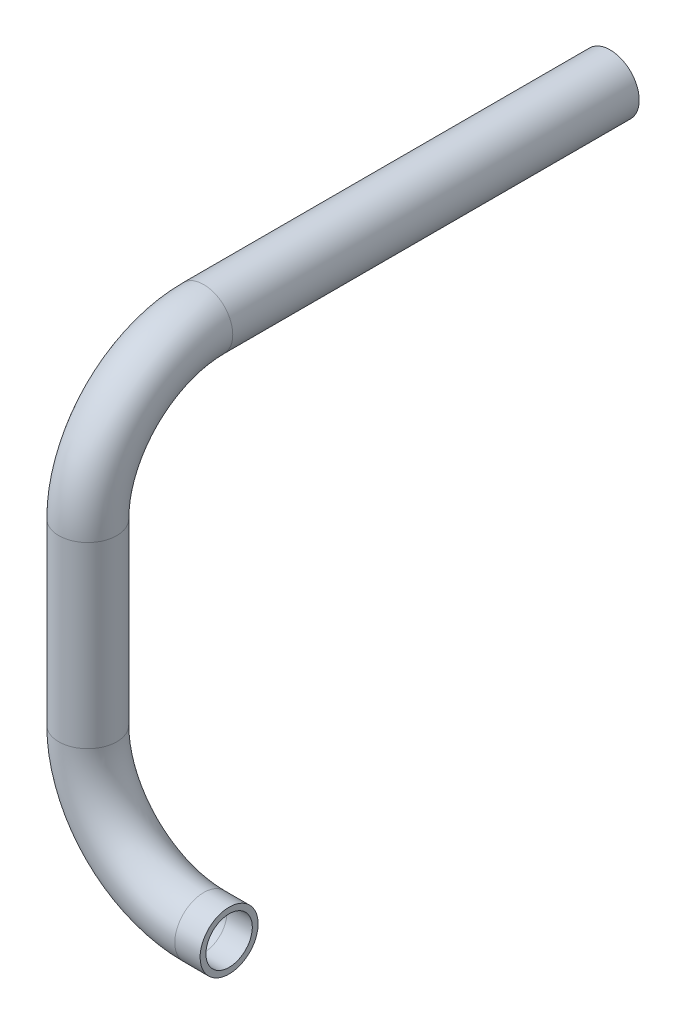
ISO-10303-21;
HEADER;
FILE_DESCRIPTION(('STEP AP214'),'2;1');
FILE_NAME('part.step','',(''),(''),'','','');
FILE_SCHEMA(('AUTOMOTIVE_DESIGN { 1 0 10303 214 1 1 1 1 }'));
ENDSEC;
DATA;
#1=APPLICATION_CONTEXT('core data for automotive mechanical design processes');
#2=APPLICATION_PROTOCOL_DEFINITION('international standard','automotive_design',2000,#1);
#3=PRODUCT_CONTEXT('',#1,'mechanical');
#4=PRODUCT('Part','Part','',(#3));
#5=PRODUCT_RELATED_PRODUCT_CATEGORY('part','',(#4));
#6=PRODUCT_DEFINITION_FORMATION('','',#4);
#7=PRODUCT_DEFINITION_CONTEXT('part definition',#1,'design');
#8=PRODUCT_DEFINITION('design','',#6,#7);
#9=PRODUCT_DEFINITION_SHAPE('','',#8);
#10=(LENGTH_UNIT() NAMED_UNIT(*) SI_UNIT(.MILLI.,.METRE.));
#11=(NAMED_UNIT(*) PLANE_ANGLE_UNIT() SI_UNIT($,.RADIAN.));
#12=(NAMED_UNIT(*) SI_UNIT($,.STERADIAN.) SOLID_ANGLE_UNIT());
#13=UNCERTAINTY_MEASURE_WITH_UNIT(LENGTH_MEASURE(1.E-05),#10,'distance_accuracy_value','');
#14=(GEOMETRIC_REPRESENTATION_CONTEXT(3) GLOBAL_UNCERTAINTY_ASSIGNED_CONTEXT((#13)) GLOBAL_UNIT_ASSIGNED_CONTEXT((#10,
#11,#12)) REPRESENTATION_CONTEXT('',''));
#15=CARTESIAN_POINT('',(0.,0.,0.));
#16=DIRECTION('',(0.,0.,1.));
#17=DIRECTION('',(1.,0.,0.));
#18=AXIS2_PLACEMENT_3D('',#15,#16,#17);
#19=CARTESIAN_POINT('',(-267.546047560903,126.276355940926,20.559623431255));
#20=DIRECTION('',(0.,0.,1.));
#21=DIRECTION('',(1.,0.,0.));
#22=AXIS2_PLACEMENT_3D('',#19,#20,#21);
#23=CYLINDRICAL_SURFACE('',#22,6.34999999999999);
#24=CARTESIAN_POINT('',(-267.546047560903,126.276355940926,109.564142662024));
#25=DIRECTION('',(0.,0.,1.));
#26=DIRECTION('',(1.,0.,0.));
#27=AXIS2_PLACEMENT_3D('',#24,#25,#26);
#28=CIRCLE('',#27,6.34999999999999);
#29=CARTESIAN_POINT('',(-267.546047560903,132.626355940925,109.564142662024));
#30=VERTEX_POINT('',#29);
#31=EDGE_CURVE('E57',#30,#30,#28,.T.);
#32=ORIENTED_EDGE('',*,*,#31,.F.);
#33=EDGE_LOOP('',(#32));
#34=FACE_BOUND('',#33,.T.);
#35=CARTESIAN_POINT('',(-267.546047560903,126.276355940926,20.559623431255));
#36=DIRECTION('',(0.,0.,1.));
#37=DIRECTION('',(1.,0.,0.));
#38=AXIS2_PLACEMENT_3D('',#35,#36,#37);
#39=CIRCLE('',#38,6.34999999999999);
#40=CARTESIAN_POINT('',(-261.196047560903,126.276355940926,20.559623431255));
#41=VERTEX_POINT('',#40);
#42=EDGE_CURVE('E54',#41,#41,#39,.T.);
#43=ORIENTED_EDGE('',*,*,#42,.T.);
#44=EDGE_LOOP('',(#43));
#45=FACE_BOUND('',#44,.T.);
#46=ADVANCED_FACE('F33',(#34,#45),#23,.T.);
#47=CARTESIAN_POINT('',(-267.546047560903,100.876355940926,109.564142662024));
#48=DIRECTION('',(1.,0.,0.));
#49=DIRECTION('',(0.,0.,-1.));
#50=AXIS2_PLACEMENT_3D('',#47,#48,#49);
#51=TOROIDAL_SURFACE('',#50,25.4,6.34999999999999);
#52=CARTESIAN_POINT('',(-267.546047560903,100.876355940926,134.964142662024));
#53=DIRECTION('',(0.,-1.,0.));
#54=DIRECTION('',(1.,0.,0.));
#55=AXIS2_PLACEMENT_3D('',#52,#53,#54);
#56=CIRCLE('',#55,6.34999999999999);
#57=CARTESIAN_POINT('',(-267.546047560903,100.876355940926,141.314142662024));
#58=VERTEX_POINT('',#57);
#59=EDGE_CURVE('E60',#58,#58,#56,.T.);
#60=CARTESIAN_POINT('',(-267.546047560903,100.876355940926,109.564142662024));
#61=DIRECTION('',(1.,0.,0.));
#62=DIRECTION('',(0.,0.,-1.));
#63=AXIS2_PLACEMENT_3D('',#60,#61,#62);
#64=CIRCLE('',#63,31.75);
#65=EDGE_CURVE('',#30,#58,#64,.T.);
#66=ORIENTED_EDGE('',*,*,#31,.T.);
#67=ORIENTED_EDGE('',*,*,#59,.F.);
#68=ORIENTED_EDGE('',*,*,#65,.T.);
#69=ORIENTED_EDGE('',*,*,#65,.F.);
#70=EDGE_LOOP('',(#66,#68,#67,#69));
#71=FACE_BOUND('',#70,.T.);
#72=ADVANCED_FACE('F79',(#71),#51,.T.);
#73=CARTESIAN_POINT('',(-267.546047560903,100.876355940926,134.964142662024));
#74=DIRECTION('',(0.,-1.,0.));
#75=DIRECTION('',(0.,0.,-1.));
#76=AXIS2_PLACEMENT_3D('',#73,#74,#75);
#77=CYLINDRICAL_SURFACE('',#76,6.34999999999999);
#78=CARTESIAN_POINT('',(-267.546047560903,61.7763559409256,134.964142662024));
#79=DIRECTION('',(0.,-1.,0.));
#80=DIRECTION('',(1.,0.,0.));
#81=AXIS2_PLACEMENT_3D('',#78,#79,#80);
#82=CIRCLE('',#81,6.34999999999999);
#83=CARTESIAN_POINT('',(-273.896047560903,61.7763559409256,134.964142662024));
#84=VERTEX_POINT('',#83);
#85=EDGE_CURVE('E62',#84,#84,#82,.T.);
#86=ORIENTED_EDGE('',*,*,#85,.F.);
#87=EDGE_LOOP('',(#86));
#88=FACE_BOUND('',#87,.T.);
#89=ORIENTED_EDGE('',*,*,#59,.T.);
#90=EDGE_LOOP('',(#89));
#91=FACE_BOUND('',#90,.T.);
#92=ADVANCED_FACE('F72',(#88,#91),#77,.T.);
#93=CARTESIAN_POINT('',(-242.146047560903,61.7763559409256,134.964142662024));
#94=DIRECTION('',(0.,0.,1.));
#95=DIRECTION('',(1.,0.,0.));
#96=AXIS2_PLACEMENT_3D('',#93,#94,#95);
#97=TOROIDAL_SURFACE('',#96,25.4,6.34999999999999);
#98=CARTESIAN_POINT('',(-242.146047560903,36.3763559409256,134.964142662024));
#99=DIRECTION('',(1.,0.,0.));
#100=DIRECTION('',(0.,1.,0.));
#101=AXIS2_PLACEMENT_3D('',#98,#99,#100);
#102=CIRCLE('',#101,6.34999999999999);
#103=CARTESIAN_POINT('',(-242.146047560903,30.0263559409256,134.964142662024));
#104=VERTEX_POINT('',#103);
#105=EDGE_CURVE('E37',#104,#104,#102,.T.);
#106=CARTESIAN_POINT('',(-242.146047560903,61.7763559409256,134.964142662024));
#107=DIRECTION('',(0.,0.,1.));
#108=DIRECTION('',(1.,0.,0.));
#109=AXIS2_PLACEMENT_3D('',#106,#107,#108);
#110=CIRCLE('',#109,31.75);
#111=EDGE_CURVE('',#84,#104,#110,.T.);
#112=ORIENTED_EDGE('',*,*,#85,.T.);
#113=ORIENTED_EDGE('',*,*,#105,.F.);
#114=ORIENTED_EDGE('',*,*,#111,.T.);
#115=ORIENTED_EDGE('',*,*,#111,.F.);
#116=EDGE_LOOP('',(#112,#114,#113,#115));
#117=FACE_BOUND('',#116,.T.);
#118=ADVANCED_FACE('F70',(#117),#97,.T.);
#119=CARTESIAN_POINT('',(-242.146047560903,36.3763559409256,134.964142662024));
#120=DIRECTION('',(1.,0.,0.));
#121=DIRECTION('',(0.,0.,-1.));
#122=AXIS2_PLACEMENT_3D('',#119,#120,#121);
#123=CYLINDRICAL_SURFACE('',#122,6.34999999999999);
#124=CARTESIAN_POINT('',(-236.59359429767,36.3763559409256,134.964142662024));
#125=DIRECTION('',(1.,0.,0.));
#126=DIRECTION('',(0.,1.,0.));
#127=AXIS2_PLACEMENT_3D('',#124,#125,#126);
#128=CIRCLE('',#127,6.34999999999999);
#129=CARTESIAN_POINT('',(-236.59359429767,42.7263559409256,134.964142662024));
#130=VERTEX_POINT('',#129);
#131=EDGE_CURVE('E50',#130,#130,#128,.T.);
#132=ORIENTED_EDGE('',*,*,#131,.F.);
#133=EDGE_LOOP('',(#132));
#134=FACE_BOUND('',#133,.T.);
#135=ORIENTED_EDGE('',*,*,#105,.T.);
#136=EDGE_LOOP('',(#135));
#137=FACE_BOUND('',#136,.T.);
#138=ADVANCED_FACE('F35',(#134,#137),#123,.T.);
#139=CARTESIAN_POINT('',(-267.546047560903,126.276355940926,20.559623431255));
#140=DIRECTION('',(0.,0.,1.));
#141=DIRECTION('',(1.,0.,0.));
#142=AXIS2_PLACEMENT_3D('',#139,#140,#141);
#143=PLANE('',#142);
#144=CARTESIAN_POINT('',(-267.546047560903,126.276355940926,20.559623431255));
#145=DIRECTION('',(0.,0.,1.));
#146=DIRECTION('',(1.,0.,0.));
#147=AXIS2_PLACEMENT_3D('',#144,#145,#146);
#148=CIRCLE('',#147,5.08000000000002);
#149=CARTESIAN_POINT('',(-262.466047560903,126.276355940926,20.559623431255));
#150=VERTEX_POINT('',#149);
#151=EDGE_CURVE('E53',#150,#150,#148,.F.);
#152=ORIENTED_EDGE('',*,*,#151,.F.);
#153=EDGE_LOOP('',(#152));
#154=FACE_BOUND('',#153,.T.);
#155=ORIENTED_EDGE('',*,*,#42,.F.);
#156=EDGE_LOOP('',(#155));
#157=FACE_BOUND('',#156,.T.);
#158=ADVANCED_FACE('F77',(#154,#157),#143,.F.);
#159=CARTESIAN_POINT('',(-236.59359429767,36.3763559409256,134.964142662024));
#160=DIRECTION('',(1.,0.,0.));
#161=DIRECTION('',(0.,1.,0.));
#162=AXIS2_PLACEMENT_3D('',#159,#160,#161);
#163=PLANE('',#162);
#164=CARTESIAN_POINT('',(-236.59359429767,36.3763559409256,134.964142662024));
#165=DIRECTION('',(1.,0.,0.));
#166=DIRECTION('',(0.,1.,0.));
#167=AXIS2_PLACEMENT_3D('',#164,#165,#166);
#168=CIRCLE('',#167,5.08000000000002);
#169=CARTESIAN_POINT('',(-236.59359429767,41.4563559409256,134.964142662024));
#170=VERTEX_POINT('',#169);
#171=EDGE_CURVE('E10',#170,#170,#168,.F.);
#172=ORIENTED_EDGE('',*,*,#171,.T.);
#173=EDGE_LOOP('',(#172));
#174=FACE_BOUND('',#173,.T.);
#175=ORIENTED_EDGE('',*,*,#131,.T.);
#176=EDGE_LOOP('',(#175));
#177=FACE_BOUND('',#176,.T.);
#178=ADVANCED_FACE('F96',(#174,#177),#163,.T.);
#179=CARTESIAN_POINT('',(-267.546047560903,126.276355940926,20.559623431255));
#180=DIRECTION('',(0.,0.,1.));
#181=DIRECTION('',(1.,0.,0.));
#182=AXIS2_PLACEMENT_3D('',#179,#180,#181);
#183=CYLINDRICAL_SURFACE('',#182,5.08000000000002);
#184=CARTESIAN_POINT('',(-267.546047560903,126.276355940926,109.564142662024));
#185=DIRECTION('',(0.,0.,1.));
#186=DIRECTION('',(1.,0.,0.));
#187=AXIS2_PLACEMENT_3D('',#184,#185,#186);
#188=CIRCLE('',#187,5.08000000000002);
#189=CARTESIAN_POINT('',(-267.546047560903,131.356355940926,109.564142662024));
#190=VERTEX_POINT('',#189);
#191=EDGE_CURVE('E192',#190,#190,#188,.F.);
#192=ORIENTED_EDGE('',*,*,#191,.F.);
#193=EDGE_LOOP('',(#192));
#194=FACE_BOUND('',#193,.T.);
#195=ORIENTED_EDGE('',*,*,#151,.T.);
#196=EDGE_LOOP('',(#195));
#197=FACE_BOUND('',#196,.T.);
#198=ADVANCED_FACE('F99',(#194,#197),#183,.F.);
#199=CARTESIAN_POINT('',(-267.546047560903,100.876355940926,109.564142662024));
#200=DIRECTION('',(1.,0.,0.));
#201=DIRECTION('',(0.,0.,-1.));
#202=AXIS2_PLACEMENT_3D('',#199,#200,#201);
#203=TOROIDAL_SURFACE('',#202,25.4,5.08000000000002);
#204=CARTESIAN_POINT('',(-267.546047560903,100.876355940926,134.964142662024));
#205=DIRECTION('',(0.,-1.,0.));
#206=DIRECTION('',(1.,0.,0.));
#207=AXIS2_PLACEMENT_3D('',#204,#205,#206);
#208=CIRCLE('',#207,5.08000000000002);
#209=CARTESIAN_POINT('',(-267.546047560903,100.876355940926,140.044142662024));
#210=VERTEX_POINT('',#209);
#211=EDGE_CURVE('E191',#210,#210,#208,.F.);
#212=CARTESIAN_POINT('',(-267.546047560903,100.876355940926,109.564142662024));
#213=DIRECTION('',(1.,0.,0.));
#214=DIRECTION('',(0.,0.,-1.));
#215=AXIS2_PLACEMENT_3D('',#212,#213,#214);
#216=CIRCLE('',#215,30.48);
#217=EDGE_CURVE('',#190,#210,#216,.T.);
#218=ORIENTED_EDGE('',*,*,#191,.T.);
#219=ORIENTED_EDGE('',*,*,#211,.F.);
#220=ORIENTED_EDGE('',*,*,#217,.T.);
#221=ORIENTED_EDGE('',*,*,#217,.F.);
#222=EDGE_LOOP('',(#218,#220,#219,#221));
#223=FACE_BOUND('',#222,.T.);
#224=ADVANCED_FACE('F154',(#223),#203,.F.);
#225=CARTESIAN_POINT('',(-267.546047560903,100.876355940926,134.964142662024));
#226=DIRECTION('',(0.,-1.,0.));
#227=DIRECTION('',(0.,0.,-1.));
#228=AXIS2_PLACEMENT_3D('',#225,#226,#227);
#229=CYLINDRICAL_SURFACE('',#228,5.08000000000002);
#230=CARTESIAN_POINT('',(-267.546047560903,61.7763559409256,134.964142662024));
#231=DIRECTION('',(0.,-1.,0.));
#232=DIRECTION('',(1.,0.,0.));
#233=AXIS2_PLACEMENT_3D('',#230,#231,#232);
#234=CIRCLE('',#233,5.08000000000002);
#235=CARTESIAN_POINT('',(-272.626047560903,61.7763559409256,134.964142662024));
#236=VERTEX_POINT('',#235);
#237=EDGE_CURVE('E46',#236,#236,#234,.F.);
#238=ORIENTED_EDGE('',*,*,#237,.F.);
#239=EDGE_LOOP('',(#238));
#240=FACE_BOUND('',#239,.T.);
#241=ORIENTED_EDGE('',*,*,#211,.T.);
#242=EDGE_LOOP('',(#241));
#243=FACE_BOUND('',#242,.T.);
#244=ADVANCED_FACE('F90',(#240,#243),#229,.F.);
#245=CARTESIAN_POINT('',(-242.146047560903,61.7763559409256,134.964142662024));
#246=DIRECTION('',(0.,0.,1.));
#247=DIRECTION('',(1.,0.,0.));
#248=AXIS2_PLACEMENT_3D('',#245,#246,#247);
#249=TOROIDAL_SURFACE('',#248,25.4,5.08000000000002);
#250=CARTESIAN_POINT('',(-242.146047560903,36.3763559409256,134.964142662024));
#251=DIRECTION('',(1.,0.,0.));
#252=DIRECTION('',(0.,1.,0.));
#253=AXIS2_PLACEMENT_3D('',#250,#251,#252);
#254=CIRCLE('',#253,5.08000000000002);
#255=CARTESIAN_POINT('',(-242.146047560903,31.2963559409256,134.964142662024));
#256=VERTEX_POINT('',#255);
#257=EDGE_CURVE('E41',#256,#256,#254,.F.);
#258=CARTESIAN_POINT('',(-242.146047560903,61.7763559409256,134.964142662024));
#259=DIRECTION('',(0.,0.,1.));
#260=DIRECTION('',(1.,0.,0.));
#261=AXIS2_PLACEMENT_3D('',#258,#259,#260);
#262=CIRCLE('',#261,30.48);
#263=EDGE_CURVE('',#236,#256,#262,.T.);
#264=ORIENTED_EDGE('',*,*,#237,.T.);
#265=ORIENTED_EDGE('',*,*,#257,.F.);
#266=ORIENTED_EDGE('',*,*,#263,.T.);
#267=ORIENTED_EDGE('',*,*,#263,.F.);
#268=EDGE_LOOP('',(#264,#266,#265,#267));
#269=FACE_BOUND('',#268,.T.);
#270=ADVANCED_FACE('F84',(#269),#249,.F.);
#271=CARTESIAN_POINT('',(-242.146047560903,36.3763559409256,134.964142662024));
#272=DIRECTION('',(1.,0.,0.));
#273=DIRECTION('',(0.,0.,-1.));
#274=AXIS2_PLACEMENT_3D('',#271,#272,#273);
#275=CYLINDRICAL_SURFACE('',#274,5.08000000000002);
#276=ORIENTED_EDGE('',*,*,#171,.F.);
#277=EDGE_LOOP('',(#276));
#278=FACE_BOUND('',#277,.T.);
#279=ORIENTED_EDGE('',*,*,#257,.T.);
#280=EDGE_LOOP('',(#279));
#281=FACE_BOUND('',#280,.T.);
#282=ADVANCED_FACE('F82',(#278,#281),#275,.F.);
#283=CLOSED_SHELL('',(#46,#72,#92,#118,#138,#158,#178,#198,#224,#244,#270,#282));
#284=MANIFOLD_SOLID_BREP('B2',#283);
#285=ADVANCED_BREP_SHAPE_REPRESENTATION('',(#18,#284),#14);
#286=SHAPE_DEFINITION_REPRESENTATION(#9,#285);
ENDSEC;
END-ISO-10303-21;
